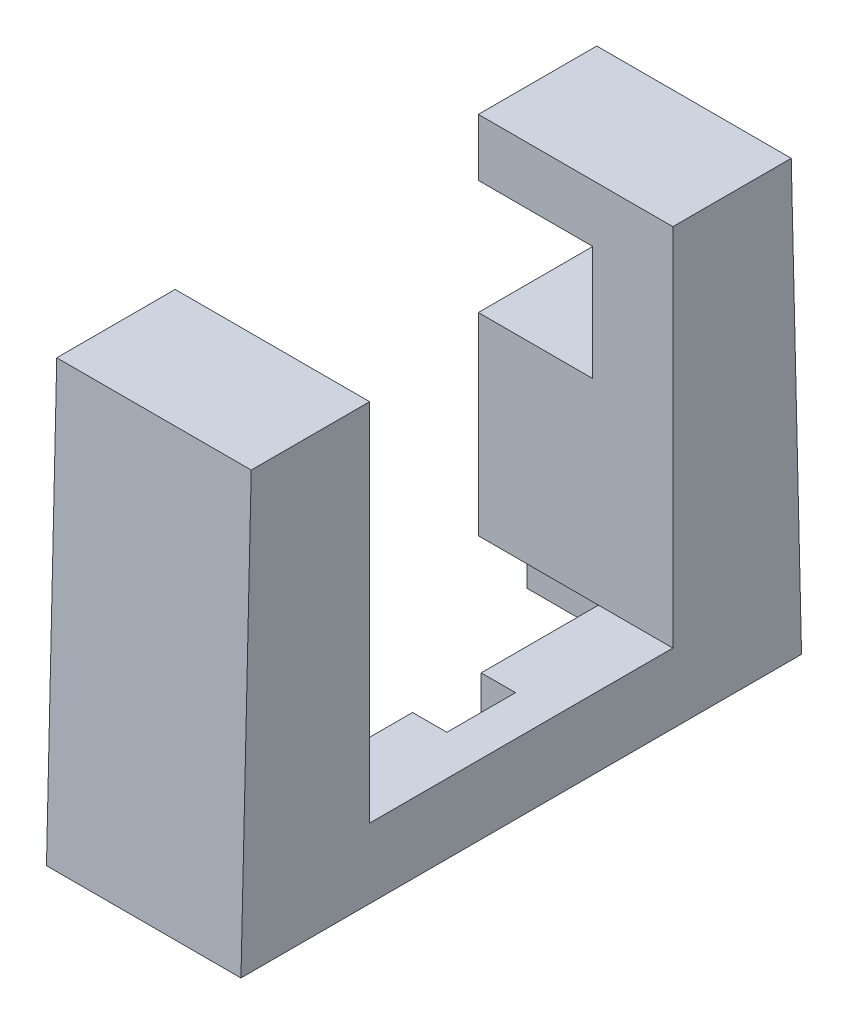
ISO-10303-21;
HEADER;
FILE_DESCRIPTION(('STEP AP214'),'2;1');
FILE_NAME('part.step','',(''),(''),'','','');
FILE_SCHEMA(('AUTOMOTIVE_DESIGN { 1 0 10303 214 1 1 1 1 }'));
ENDSEC;
DATA;
#1=APPLICATION_CONTEXT('core data for automotive mechanical design processes');
#2=APPLICATION_PROTOCOL_DEFINITION('international standard','automotive_design',2000,#1);
#3=PRODUCT_CONTEXT('',#1,'mechanical');
#4=PRODUCT('Part','Part','',(#3));
#5=PRODUCT_RELATED_PRODUCT_CATEGORY('part','',(#4));
#6=PRODUCT_DEFINITION_FORMATION('','',#4);
#7=PRODUCT_DEFINITION_CONTEXT('part definition',#1,'design');
#8=PRODUCT_DEFINITION('design','',#6,#7);
#9=PRODUCT_DEFINITION_SHAPE('','',#8);
#10=(LENGTH_UNIT() NAMED_UNIT(*) SI_UNIT(.MILLI.,.METRE.));
#11=(NAMED_UNIT(*) PLANE_ANGLE_UNIT() SI_UNIT($,.RADIAN.));
#12=(NAMED_UNIT(*) SI_UNIT($,.STERADIAN.) SOLID_ANGLE_UNIT());
#13=UNCERTAINTY_MEASURE_WITH_UNIT(LENGTH_MEASURE(1.E-05),#10,'distance_accuracy_value','');
#14=(GEOMETRIC_REPRESENTATION_CONTEXT(3) GLOBAL_UNCERTAINTY_ASSIGNED_CONTEXT((#13)) GLOBAL_UNIT_ASSIGNED_CONTEXT((#10,
#11,#12)) REPRESENTATION_CONTEXT('',''));
#15=CARTESIAN_POINT('',(0.,0.,0.));
#16=DIRECTION('',(0.,0.,1.));
#17=DIRECTION('',(1.,0.,0.));
#18=AXIS2_PLACEMENT_3D('',#15,#16,#17);
#19=CARTESIAN_POINT('',(17.,38.,-24.5));
#20=DIRECTION('',(-1.,0.,0.));
#21=DIRECTION('',(0.,0.,1.));
#22=AXIS2_PLACEMENT_3D('',#19,#20,#21);
#23=PLANE('',#22);
#24=DIRECTION('',(0.,0.999719647026643,0.0236775705874725));
#25=VECTOR('',#24,1.);
#26=CARTESIAN_POINT('',(17.,37.9786961607409,-23.600504564614));
#27=LINE('',#26,#25);
#28=CARTESIAN_POINT('',(17.,0.,-24.5));
#29=VERTEX_POINT('',#28);
#30=CARTESIAN_POINT('',(17.,38.,-23.6));
#31=VERTEX_POINT('',#30);
#32=EDGE_CURVE('E206',#29,#31,#27,.T.);
#33=ORIENTED_EDGE('',*,*,#32,.F.);
#34=DIRECTION('',(0.,0.,-1.));
#35=VECTOR('',#34,1.);
#36=CARTESIAN_POINT('',(17.,0.,0.));
#37=LINE('',#36,#35);
#38=CARTESIAN_POINT('',(17.,0.,-17.5));
#39=VERTEX_POINT('',#38);
#40=EDGE_CURVE('E41',#39,#29,#37,.T.);
#41=ORIENTED_EDGE('',*,*,#40,.F.);
#42=DIRECTION('',(0.,-1.,0.));
#43=VECTOR('',#42,1.);
#44=CARTESIAN_POINT('',(17.,71.2920240520265,-17.5));
#45=LINE('',#44,#43);
#46=CARTESIAN_POINT('',(17.,6.09999999999999,-17.5));
#47=VERTEX_POINT('',#46);
#48=EDGE_CURVE('E49',#47,#39,#45,.T.);
#49=ORIENTED_EDGE('',*,*,#48,.F.);
#50=DIRECTION('',(0.,0.,-1.));
#51=VECTOR('',#50,1.);
#52=CARTESIAN_POINT('',(17.,6.1,-24.5));
#53=LINE('',#52,#51);
#54=CARTESIAN_POINT('',(17.,6.1,-13.25));
#55=VERTEX_POINT('',#54);
#56=EDGE_CURVE('E291',#55,#47,#53,.T.);
#57=ORIENTED_EDGE('',*,*,#56,.F.);
#58=DIRECTION('',(0.,-1.,0.));
#59=VECTOR('',#58,1.);
#60=CARTESIAN_POINT('',(17.,38.,-13.25));
#61=LINE('',#60,#59);
#62=CARTESIAN_POINT('',(17.,23.,-13.25));
#63=VERTEX_POINT('',#62);
#64=EDGE_CURVE('E242',#63,#55,#61,.T.);
#65=ORIENTED_EDGE('',*,*,#64,.F.);
#66=DIRECTION('',(0.,0.,-1.));
#67=VECTOR('',#66,1.);
#68=CARTESIAN_POINT('',(17.,23.,23.25));
#69=LINE('',#68,#67);
#70=CARTESIAN_POINT('',(17.,23.,-23.25));
#71=VERTEX_POINT('',#70);
#72=EDGE_CURVE('E316',#63,#71,#69,.T.);
#73=ORIENTED_EDGE('',*,*,#72,.T.);
#74=DIRECTION('',(0.,1.,0.));
#75=VECTOR('',#74,1.);
#76=CARTESIAN_POINT('',(17.,33.,-23.25));
#77=LINE('',#76,#75);
#78=CARTESIAN_POINT('',(17.,33.,-23.25));
#79=VERTEX_POINT('',#78);
#80=EDGE_CURVE('E332',#71,#79,#77,.T.);
#81=ORIENTED_EDGE('',*,*,#80,.T.);
#82=DIRECTION('',(0.,0.,1.));
#83=VECTOR('',#82,1.);
#84=CARTESIAN_POINT('',(17.,33.,23.25));
#85=LINE('',#84,#83);
#86=CARTESIAN_POINT('',(17.,33.,-13.25));
#87=VERTEX_POINT('',#86);
#88=EDGE_CURVE('E327',#79,#87,#85,.T.);
#89=ORIENTED_EDGE('',*,*,#88,.T.);
#90=CARTESIAN_POINT('',(17.,38.,-13.25));
#91=VERTEX_POINT('',#90);
#92=EDGE_CURVE('E238',#91,#87,#61,.T.);
#93=ORIENTED_EDGE('',*,*,#92,.F.);
#94=DIRECTION('',(0.,0.,-1.));
#95=VECTOR('',#94,1.);
#96=CARTESIAN_POINT('',(17.,38.,-24.5));
#97=LINE('',#96,#95);
#98=EDGE_CURVE('E228',#91,#31,#97,.T.);
#99=ORIENTED_EDGE('',*,*,#98,.T.);
#100=EDGE_LOOP('',(#33,#41,#49,#57,#65,#73,#81,#89,#93,#99));
#101=FACE_BOUND('',#100,.T.);
#102=ADVANCED_FACE('F32',(#101),#23,.T.);
#103=CARTESIAN_POINT('',(30.5,38.001,-3.));
#104=DIRECTION('',(0.,0.,-1.));
#105=DIRECTION('',(-1.,0.,0.));
#106=AXIS2_PLACEMENT_3D('',#103,#104,#105);
#107=PLANE('',#106);
#108=DIRECTION('',(0.,-1.,0.));
#109=VECTOR('',#108,1.);
#110=CARTESIAN_POINT('',(27.5,38.001,-3.));
#111=LINE('',#110,#109);
#112=CARTESIAN_POINT('',(27.5,6.09999999999999,-3.));
#113=VERTEX_POINT('',#112);
#114=CARTESIAN_POINT('',(27.5,0.,-3.));
#115=VERTEX_POINT('',#114);
#116=EDGE_CURVE('E410',#113,#115,#111,.T.);
#117=ORIENTED_EDGE('',*,*,#116,.T.);
#118=DIRECTION('',(1.,0.,0.));
#119=VECTOR('',#118,1.);
#120=CARTESIAN_POINT('',(30.5,0.,-3.));
#121=LINE('',#120,#119);
#122=CARTESIAN_POINT('',(30.5,0.,-3.));
#123=VERTEX_POINT('',#122);
#124=EDGE_CURVE('E422',#115,#123,#121,.T.);
#125=ORIENTED_EDGE('',*,*,#124,.T.);
#126=DIRECTION('',(0.,-1.,0.));
#127=VECTOR('',#126,1.);
#128=CARTESIAN_POINT('',(30.5,38.001,-3.));
#129=LINE('',#128,#127);
#130=CARTESIAN_POINT('',(30.5,6.1,-3.));
#131=VERTEX_POINT('',#130);
#132=EDGE_CURVE('E412',#131,#123,#129,.T.);
#133=ORIENTED_EDGE('',*,*,#132,.F.);
#134=DIRECTION('',(1.,0.,0.));
#135=VECTOR('',#134,1.);
#136=CARTESIAN_POINT('',(30.5,6.1,-3.));
#137=LINE('',#136,#135);
#138=EDGE_CURVE('E405',#113,#131,#137,.T.);
#139=ORIENTED_EDGE('',*,*,#138,.F.);
#140=EDGE_LOOP('',(#117,#125,#133,#139));
#141=FACE_BOUND('',#140,.T.);
#142=ADVANCED_FACE('F482',(#141),#107,.F.);
#143=CARTESIAN_POINT('',(30.5,38.001,-3.));
#144=DIRECTION('',(1.,0.,0.));
#145=DIRECTION('',(0.,0.,-1.));
#146=AXIS2_PLACEMENT_3D('',#143,#144,#145);
#147=PLANE('',#146);
#148=ORIENTED_EDGE('',*,*,#132,.T.);
#149=DIRECTION('',(0.,0.,1.));
#150=VECTOR('',#149,1.);
#151=CARTESIAN_POINT('',(30.5,0.,-3.));
#152=LINE('',#151,#150);
#153=CARTESIAN_POINT('',(30.5,0.,3.));
#154=VERTEX_POINT('',#153);
#155=EDGE_CURVE('E419',#123,#154,#152,.T.);
#156=ORIENTED_EDGE('',*,*,#155,.T.);
#157=DIRECTION('',(0.,-1.,0.));
#158=VECTOR('',#157,1.);
#159=CARTESIAN_POINT('',(30.5,38.001,3.));
#160=LINE('',#159,#158);
#161=CARTESIAN_POINT('',(30.5,6.1,3.));
#162=VERTEX_POINT('',#161);
#163=EDGE_CURVE('E415',#162,#154,#160,.T.);
#164=ORIENTED_EDGE('',*,*,#163,.F.);
#165=DIRECTION('',(0.,0.,1.));
#166=VECTOR('',#165,1.);
#167=CARTESIAN_POINT('',(30.5,6.1,-3.));
#168=LINE('',#167,#166);
#169=EDGE_CURVE('E426',#131,#162,#168,.T.);
#170=ORIENTED_EDGE('',*,*,#169,.F.);
#171=EDGE_LOOP('',(#148,#156,#164,#170));
#172=FACE_BOUND('',#171,.T.);
#173=ADVANCED_FACE('F487',(#172),#147,.F.);
#174=CARTESIAN_POINT('',(30.5,38.001,3.));
#175=DIRECTION('',(0.,0.,1.));
#176=DIRECTION('',(1.,0.,0.));
#177=AXIS2_PLACEMENT_3D('',#174,#175,#176);
#178=PLANE('',#177);
#179=ORIENTED_EDGE('',*,*,#163,.T.);
#180=DIRECTION('',(-1.,0.,0.));
#181=VECTOR('',#180,1.);
#182=CARTESIAN_POINT('',(30.5,0.,3.));
#183=LINE('',#182,#181);
#184=CARTESIAN_POINT('',(27.5,0.,3.));
#185=VERTEX_POINT('',#184);
#186=EDGE_CURVE('E413',#154,#185,#183,.T.);
#187=ORIENTED_EDGE('',*,*,#186,.T.);
#188=DIRECTION('',(0.,-1.,0.));
#189=VECTOR('',#188,1.);
#190=CARTESIAN_POINT('',(27.5,38.001,3.));
#191=LINE('',#190,#189);
#192=CARTESIAN_POINT('',(27.5,6.09999999999999,3.));
#193=VERTEX_POINT('',#192);
#194=EDGE_CURVE('E409',#193,#185,#191,.T.);
#195=ORIENTED_EDGE('',*,*,#194,.F.);
#196=DIRECTION('',(-1.,0.,0.));
#197=VECTOR('',#196,1.);
#198=CARTESIAN_POINT('',(30.5,6.1,3.));
#199=LINE('',#198,#197);
#200=EDGE_CURVE('E381',#162,#193,#199,.T.);
#201=ORIENTED_EDGE('',*,*,#200,.F.);
#202=EDGE_LOOP('',(#179,#187,#195,#201));
#203=FACE_BOUND('',#202,.T.);
#204=ADVANCED_FACE('F503',(#203),#178,.F.);
#205=CARTESIAN_POINT('',(0.,6.1,0.));
#206=DIRECTION('',(0.,1.,0.));
#207=DIRECTION('',(0.,0.,1.));
#208=AXIS2_PLACEMENT_3D('',#205,#206,#207);
#209=PLANE('',#208);
#210=ORIENTED_EDGE('',*,*,#200,.T.);
#211=DIRECTION('',(0.,0.,1.));
#212=VECTOR('',#211,1.);
#213=CARTESIAN_POINT('',(27.5,6.09999999999999,-17.5));
#214=LINE('',#213,#212);
#215=CARTESIAN_POINT('',(27.5,6.09999999999999,13.25));
#216=VERTEX_POINT('',#215);
#217=EDGE_CURVE('E379',#193,#216,#214,.T.);
#218=ORIENTED_EDGE('',*,*,#217,.T.);
#219=DIRECTION('',(-1.,0.,0.));
#220=VECTOR('',#219,1.);
#221=CARTESIAN_POINT('',(0.,6.1,13.25));
#222=LINE('',#221,#220);
#223=CARTESIAN_POINT('',(34.,6.1,13.25));
#224=VERTEX_POINT('',#223);
#225=EDGE_CURVE('E265',#224,#216,#222,.T.);
#226=ORIENTED_EDGE('',*,*,#225,.F.);
#227=DIRECTION('',(0.,0.,-1.));
#228=VECTOR('',#227,1.);
#229=CARTESIAN_POINT('',(34.,6.1,24.5));
#230=LINE('',#229,#228);
#231=CARTESIAN_POINT('',(34.,6.1,-13.25));
#232=VERTEX_POINT('',#231);
#233=EDGE_CURVE('E211',#224,#232,#230,.T.);
#234=ORIENTED_EDGE('',*,*,#233,.T.);
#235=DIRECTION('',(1.,0.,0.));
#236=VECTOR('',#235,1.);
#237=CARTESIAN_POINT('',(0.,6.1,-13.25));
#238=LINE('',#237,#236);
#239=CARTESIAN_POINT('',(27.5,6.1,-13.25));
#240=VERTEX_POINT('',#239);
#241=EDGE_CURVE('E241',#240,#232,#238,.T.);
#242=ORIENTED_EDGE('',*,*,#241,.F.);
#243=EDGE_CURVE('E384',#240,#113,#214,.T.);
#244=ORIENTED_EDGE('',*,*,#243,.T.);
#245=ORIENTED_EDGE('',*,*,#138,.T.);
#246=ORIENTED_EDGE('',*,*,#169,.T.);
#247=EDGE_LOOP('',(#210,#218,#226,#234,#242,#244,#245,#246));
#248=FACE_BOUND('',#247,.T.);
#249=ADVANCED_FACE('F376',(#248),#209,.T.);
#250=CARTESIAN_POINT('',(-34.001,23.,23.25));
#251=DIRECTION('',(0.,-1.,0.));
#252=DIRECTION('',(0.,0.,-1.));
#253=AXIS2_PLACEMENT_3D('',#250,#251,#252);
#254=PLANE('',#253);
#255=DIRECTION('',(-1.,0.,0.));
#256=VECTOR('',#255,1.);
#257=CARTESIAN_POINT('',(-34.001,23.,-13.25));
#258=LINE('',#257,#256);
#259=CARTESIAN_POINT('',(27.,23.,-13.25));
#260=VERTEX_POINT('',#259);
#261=EDGE_CURVE('E320',#260,#63,#258,.T.);
#262=ORIENTED_EDGE('',*,*,#261,.F.);
#263=DIRECTION('',(0.,0.,-1.));
#264=VECTOR('',#263,1.);
#265=CARTESIAN_POINT('',(27.,23.,23.25));
#266=LINE('',#265,#264);
#267=CARTESIAN_POINT('',(27.,23.,-23.25));
#268=VERTEX_POINT('',#267);
#269=EDGE_CURVE('E323',#260,#268,#266,.T.);
#270=ORIENTED_EDGE('',*,*,#269,.T.);
#271=DIRECTION('',(1.,0.,0.));
#272=VECTOR('',#271,1.);
#273=CARTESIAN_POINT('',(-34.001,23.,-23.25));
#274=LINE('',#273,#272);
#275=EDGE_CURVE('E319',#71,#268,#274,.T.);
#276=ORIENTED_EDGE('',*,*,#275,.F.);
#277=ORIENTED_EDGE('',*,*,#72,.F.);
#278=EDGE_LOOP('',(#262,#270,#276,#277));
#279=FACE_BOUND('',#278,.T.);
#280=ADVANCED_FACE('F445',(#279),#254,.F.);
#281=CARTESIAN_POINT('',(34.,38.,13.25));
#282=DIRECTION('',(0.,0.,-1.));
#283=DIRECTION('',(-1.,0.,0.));
#284=AXIS2_PLACEMENT_3D('',#281,#282,#283);
#285=PLANE('',#284);
#286=DIRECTION('',(1.,0.,0.));
#287=VECTOR('',#286,1.);
#288=CARTESIAN_POINT('',(-34.001,23.,13.25));
#289=LINE('',#288,#287);
#290=CARTESIAN_POINT('',(17.,23.,13.25));
#291=VERTEX_POINT('',#290);
#292=CARTESIAN_POINT('',(27.,23.,13.25));
#293=VERTEX_POINT('',#292);
#294=EDGE_CURVE('E306',#291,#293,#289,.T.);
#295=ORIENTED_EDGE('',*,*,#294,.T.);
#296=DIRECTION('',(0.,1.,0.));
#297=VECTOR('',#296,1.);
#298=CARTESIAN_POINT('',(27.,0.,13.25));
#299=LINE('',#298,#297);
#300=CARTESIAN_POINT('',(27.,33.,13.25));
#301=VERTEX_POINT('',#300);
#302=EDGE_CURVE('E346',#293,#301,#299,.T.);
#303=ORIENTED_EDGE('',*,*,#302,.T.);
#304=DIRECTION('',(-1.,0.,0.));
#305=VECTOR('',#304,1.);
#306=CARTESIAN_POINT('',(-34.001,33.,13.25));
#307=LINE('',#306,#305);
#308=CARTESIAN_POINT('',(17.,33.,13.25));
#309=VERTEX_POINT('',#308);
#310=EDGE_CURVE('E357',#301,#309,#307,.T.);
#311=ORIENTED_EDGE('',*,*,#310,.T.);
#312=DIRECTION('',(0.,-1.,0.));
#313=VECTOR('',#312,1.);
#314=CARTESIAN_POINT('',(17.,38.,13.25));
#315=LINE('',#314,#313);
#316=CARTESIAN_POINT('',(17.,38.,13.25));
#317=VERTEX_POINT('',#316);
#318=EDGE_CURVE('E260',#317,#309,#315,.T.);
#319=ORIENTED_EDGE('',*,*,#318,.F.);
#320=DIRECTION('',(1.,0.,0.));
#321=VECTOR('',#320,1.);
#322=CARTESIAN_POINT('',(34.,38.,13.25));
#323=LINE('',#322,#321);
#324=CARTESIAN_POINT('',(34.,38.,13.25));
#325=VERTEX_POINT('',#324);
#326=EDGE_CURVE('E252',#317,#325,#323,.T.);
#327=ORIENTED_EDGE('',*,*,#326,.T.);
#328=DIRECTION('',(0.,-1.,0.));
#329=VECTOR('',#328,1.);
#330=CARTESIAN_POINT('',(34.,38.,13.25));
#331=LINE('',#330,#329);
#332=EDGE_CURVE('E256',#325,#224,#331,.T.);
#333=ORIENTED_EDGE('',*,*,#332,.T.);
#334=ORIENTED_EDGE('',*,*,#225,.T.);
#335=DIRECTION('',(1.,0.,0.));
#336=VECTOR('',#335,1.);
#337=CARTESIAN_POINT('',(34.,6.1,13.25));
#338=LINE('',#337,#336);
#339=CARTESIAN_POINT('',(17.,6.1,13.25));
#340=VERTEX_POINT('',#339);
#341=EDGE_CURVE('E307',#340,#216,#338,.T.);
#342=ORIENTED_EDGE('',*,*,#341,.F.);
#343=EDGE_CURVE('E255',#291,#340,#315,.T.);
#344=ORIENTED_EDGE('',*,*,#343,.F.);
#345=EDGE_LOOP('',(#295,#303,#311,#319,#327,#333,#334,#342,#344));
#346=FACE_BOUND('',#345,.T.);
#347=ADVANCED_FACE('F304',(#346),#285,.T.);
#348=CARTESIAN_POINT('',(34.,38.,-13.25));
#349=DIRECTION('',(0.,0.,1.));
#350=DIRECTION('',(1.,0.,0.));
#351=AXIS2_PLACEMENT_3D('',#348,#349,#350);
#352=PLANE('',#351);
#353=ORIENTED_EDGE('',*,*,#261,.T.);
#354=ORIENTED_EDGE('',*,*,#64,.T.);
#355=EDGE_CURVE('E244',#55,#240,#238,.T.);
#356=ORIENTED_EDGE('',*,*,#355,.T.);
#357=ORIENTED_EDGE('',*,*,#241,.T.);
#358=DIRECTION('',(0.,-1.,0.));
#359=VECTOR('',#358,1.);
#360=CARTESIAN_POINT('',(34.,38.,-13.25));
#361=LINE('',#360,#359);
#362=CARTESIAN_POINT('',(34.,38.,-13.25));
#363=VERTEX_POINT('',#362);
#364=EDGE_CURVE('E237',#363,#232,#361,.T.);
#365=ORIENTED_EDGE('',*,*,#364,.F.);
#366=DIRECTION('',(-1.,0.,0.));
#367=VECTOR('',#366,1.);
#368=CARTESIAN_POINT('',(34.,38.,-13.25));
#369=LINE('',#368,#367);
#370=EDGE_CURVE('E225',#363,#91,#369,.T.);
#371=ORIENTED_EDGE('',*,*,#370,.T.);
#372=ORIENTED_EDGE('',*,*,#92,.T.);
#373=DIRECTION('',(1.,0.,0.));
#374=VECTOR('',#373,1.);
#375=CARTESIAN_POINT('',(-34.001,33.,-13.25));
#376=LINE('',#375,#374);
#377=CARTESIAN_POINT('',(27.,33.,-13.25));
#378=VERTEX_POINT('',#377);
#379=EDGE_CURVE('E330',#87,#378,#376,.T.);
#380=ORIENTED_EDGE('',*,*,#379,.T.);
#381=DIRECTION('',(0.,-1.,0.));
#382=VECTOR('',#381,1.);
#383=CARTESIAN_POINT('',(27.,0.,-13.25));
#384=LINE('',#383,#382);
#385=EDGE_CURVE('E310',#378,#260,#384,.T.);
#386=ORIENTED_EDGE('',*,*,#385,.T.);
#387=EDGE_LOOP('',(#353,#354,#356,#357,#365,#371,#372,#380,#386));
#388=FACE_BOUND('',#387,.T.);
#389=ADVANCED_FACE('F439',(#388),#352,.T.);
#390=CARTESIAN_POINT('',(27.5,71.2920240520265,-17.5));
#391=DIRECTION('',(1.,0.,0.));
#392=DIRECTION('',(0.,0.,-1.));
#393=AXIS2_PLACEMENT_3D('',#390,#391,#392);
#394=PLANE('',#393);
#395=DIRECTION('',(0.,0.,1.));
#396=VECTOR('',#395,1.);
#397=CARTESIAN_POINT('',(27.5,0.,-17.5));
#398=LINE('',#397,#396);
#399=CARTESIAN_POINT('',(27.5,0.,-17.5));
#400=VERTEX_POINT('',#399);
#401=EDGE_CURVE('E399',#400,#115,#398,.T.);
#402=ORIENTED_EDGE('',*,*,#401,.T.);
#403=ORIENTED_EDGE('',*,*,#116,.F.);
#404=ORIENTED_EDGE('',*,*,#243,.F.);
#405=CARTESIAN_POINT('',(27.5,6.09999999999999,-17.5));
#406=VERTEX_POINT('',#405);
#407=EDGE_CURVE('E386',#406,#240,#214,.T.);
#408=ORIENTED_EDGE('',*,*,#407,.F.);
#409=DIRECTION('',(0.,-1.,0.));
#410=VECTOR('',#409,1.);
#411=CARTESIAN_POINT('',(27.5,71.2920240520265,-17.5));
#412=LINE('',#411,#410);
#413=EDGE_CURVE('E387',#406,#400,#412,.T.);
#414=ORIENTED_EDGE('',*,*,#413,.T.);
#415=EDGE_LOOP('',(#402,#403,#404,#408,#414));
#416=FACE_BOUND('',#415,.T.);
#417=ADVANCED_FACE('F494',(#416),#394,.F.);
#418=ORIENTED_EDGE('',*,*,#217,.F.);
#419=ORIENTED_EDGE('',*,*,#194,.T.);
#420=CARTESIAN_POINT('',(27.5,0.,17.5));
#421=VERTEX_POINT('',#420);
#422=EDGE_CURVE('E404',#185,#421,#398,.T.);
#423=ORIENTED_EDGE('',*,*,#422,.T.);
#424=DIRECTION('',(0.,-1.,0.));
#425=VECTOR('',#424,1.);
#426=CARTESIAN_POINT('',(27.5,71.2920240520265,17.5));
#427=LINE('',#426,#425);
#428=CARTESIAN_POINT('',(27.5,6.09999999999999,17.5));
#429=VERTEX_POINT('',#428);
#430=EDGE_CURVE('E292',#429,#421,#427,.T.);
#431=ORIENTED_EDGE('',*,*,#430,.F.);
#432=EDGE_CURVE('E290',#216,#429,#214,.T.);
#433=ORIENTED_EDGE('',*,*,#432,.F.);
#434=EDGE_LOOP('',(#418,#419,#423,#431,#433));
#435=FACE_BOUND('',#434,.T.);
#436=ADVANCED_FACE('F514',(#435),#394,.F.);
#437=CARTESIAN_POINT('',(0.,6.1,0.));
#438=DIRECTION('',(0.,1.,0.));
#439=DIRECTION('',(0.,0.,1.));
#440=AXIS2_PLACEMENT_3D('',#437,#438,#439);
#441=PLANE('',#440);
#442=ORIENTED_EDGE('',*,*,#341,.T.);
#443=ORIENTED_EDGE('',*,*,#432,.T.);
#444=DIRECTION('',(-1.,0.,0.));
#445=VECTOR('',#444,1.);
#446=CARTESIAN_POINT('',(27.5,6.09999999999999,17.5));
#447=LINE('',#446,#445);
#448=CARTESIAN_POINT('',(17.,6.09999999999999,17.5));
#449=VERTEX_POINT('',#448);
#450=EDGE_CURVE('E281',#429,#449,#447,.T.);
#451=ORIENTED_EDGE('',*,*,#450,.T.);
#452=DIRECTION('',(0.,0.,1.));
#453=VECTOR('',#452,1.);
#454=CARTESIAN_POINT('',(17.,6.1,0.));
#455=LINE('',#454,#453);
#456=EDGE_CURVE('E259',#340,#449,#455,.T.);
#457=ORIENTED_EDGE('',*,*,#456,.F.);
#458=EDGE_LOOP('',(#442,#443,#451,#457));
#459=FACE_BOUND('',#458,.T.);
#460=ADVANCED_FACE('F287',(#459),#441,.F.);
#461=CARTESIAN_POINT('',(0.,38.,0.));
#462=DIRECTION('',(0.,1.,0.));
#463=DIRECTION('',(0.,0.,1.));
#464=AXIS2_PLACEMENT_3D('',#461,#462,#463);
#465=PLANE('',#464);
#466=DIRECTION('',(1.,0.,0.));
#467=VECTOR('',#466,1.);
#468=CARTESIAN_POINT('',(-34.,38.,23.6));
#469=LINE('',#468,#467);
#470=CARTESIAN_POINT('',(17.,38.,23.6));
#471=VERTEX_POINT('',#470);
#472=CARTESIAN_POINT('',(34.,38.,23.6));
#473=VERTEX_POINT('',#472);
#474=EDGE_CURVE('E371',#471,#473,#469,.T.);
#475=ORIENTED_EDGE('',*,*,#474,.T.);
#476=DIRECTION('',(0.,0.,1.));
#477=VECTOR('',#476,1.);
#478=CARTESIAN_POINT('',(34.,38.,24.5));
#479=LINE('',#478,#477);
#480=EDGE_CURVE('E247',#325,#473,#479,.T.);
#481=ORIENTED_EDGE('',*,*,#480,.F.);
#482=ORIENTED_EDGE('',*,*,#326,.F.);
#483=DIRECTION('',(0.,0.,-1.));
#484=VECTOR('',#483,1.);
#485=CARTESIAN_POINT('',(17.,38.,24.5));
#486=LINE('',#485,#484);
#487=EDGE_CURVE('E250',#471,#317,#486,.T.);
#488=ORIENTED_EDGE('',*,*,#487,.F.);
#489=EDGE_LOOP('',(#475,#481,#482,#488));
#490=FACE_BOUND('',#489,.T.);
#491=ADVANCED_FACE('F369',(#490),#465,.T.);
#492=CARTESIAN_POINT('',(34.,6.1,24.5));
#493=DIRECTION('',(-1.,0.,0.));
#494=DIRECTION('',(0.,0.,1.));
#495=AXIS2_PLACEMENT_3D('',#492,#493,#494);
#496=PLANE('',#495);
#497=DIRECTION('',(0.,0.,-1.));
#498=VECTOR('',#497,1.);
#499=CARTESIAN_POINT('',(34.,0.,24.5));
#500=LINE('',#499,#498);
#501=CARTESIAN_POINT('',(34.,0.,24.5));
#502=VERTEX_POINT('',#501);
#503=CARTESIAN_POINT('',(34.,1.70870262383715E-13,-24.5));
#504=VERTEX_POINT('',#503);
#505=EDGE_CURVE('E219',#502,#504,#500,.T.);
#506=ORIENTED_EDGE('',*,*,#505,.T.);
#507=DIRECTION('',(0.,-0.999719647026643,-0.0236775705874725));
#508=VECTOR('',#507,1.);
#509=CARTESIAN_POINT('',(34.,1.70870262383715E-13,-24.5));
#510=LINE('',#509,#508);
#511=CARTESIAN_POINT('',(34.,38.,-23.6));
#512=VERTEX_POINT('',#511);
#513=EDGE_CURVE('E204',#512,#504,#510,.T.);
#514=ORIENTED_EDGE('',*,*,#513,.F.);
#515=DIRECTION('',(0.,0.,1.));
#516=VECTOR('',#515,1.);
#517=CARTESIAN_POINT('',(34.,38.,-24.5));
#518=LINE('',#517,#516);
#519=EDGE_CURVE('E215',#512,#363,#518,.T.);
#520=ORIENTED_EDGE('',*,*,#519,.T.);
#521=ORIENTED_EDGE('',*,*,#364,.T.);
#522=ORIENTED_EDGE('',*,*,#233,.F.);
#523=ORIENTED_EDGE('',*,*,#332,.F.);
#524=ORIENTED_EDGE('',*,*,#480,.T.);
#525=DIRECTION('',(0.,0.999719647026643,-0.0236775705874732));
#526=VECTOR('',#525,1.);
#527=CARTESIAN_POINT('',(34.,0.,24.5));
#528=LINE('',#527,#526);
#529=EDGE_CURVE('E430',#502,#473,#528,.T.);
#530=ORIENTED_EDGE('',*,*,#529,.F.);
#531=EDGE_LOOP('',(#506,#514,#520,#521,#522,#523,#524,#530));
#532=FACE_BOUND('',#531,.T.);
#533=ADVANCED_FACE('F34',(#532),#496,.F.);
#534=CARTESIAN_POINT('',(0.,38.,0.));
#535=DIRECTION('',(0.,-1.,0.));
#536=DIRECTION('',(0.,0.,-1.));
#537=AXIS2_PLACEMENT_3D('',#534,#535,#536);
#538=PLANE('',#537);
#539=ORIENTED_EDGE('',*,*,#519,.F.);
#540=DIRECTION('',(-1.,0.,0.));
#541=VECTOR('',#540,1.);
#542=CARTESIAN_POINT('',(0.,38.,-23.6));
#543=LINE('',#542,#541);
#544=EDGE_CURVE('E200',#512,#31,#543,.T.);
#545=ORIENTED_EDGE('',*,*,#544,.T.);
#546=ORIENTED_EDGE('',*,*,#98,.F.);
#547=ORIENTED_EDGE('',*,*,#370,.F.);
#548=EDGE_LOOP('',(#539,#545,#546,#547));
#549=FACE_BOUND('',#548,.T.);
#550=ADVANCED_FACE('F223',(#549),#538,.F.);
#551=CARTESIAN_POINT('',(0.,0.,0.));
#552=DIRECTION('',(0.,1.,0.));
#553=DIRECTION('',(0.,0.,1.));
#554=AXIS2_PLACEMENT_3D('',#551,#552,#553);
#555=PLANE('',#554);
#556=DIRECTION('',(1.,0.,0.));
#557=VECTOR('',#556,1.);
#558=CARTESIAN_POINT('',(34.,0.,24.5));
#559=LINE('',#558,#557);
#560=CARTESIAN_POINT('',(17.,0.,24.5));
#561=VERTEX_POINT('',#560);
#562=EDGE_CURVE('E268',#561,#502,#559,.T.);
#563=ORIENTED_EDGE('',*,*,#562,.F.);
#564=CARTESIAN_POINT('',(17.,0.,17.5));
#565=VERTEX_POINT('',#564);
#566=EDGE_CURVE('E11',#561,#565,#37,.T.);
#567=ORIENTED_EDGE('',*,*,#566,.T.);
#568=DIRECTION('',(-1.,0.,0.));
#569=VECTOR('',#568,1.);
#570=CARTESIAN_POINT('',(27.5,0.,17.5));
#571=LINE('',#570,#569);
#572=EDGE_CURVE('E283',#421,#565,#571,.T.);
#573=ORIENTED_EDGE('',*,*,#572,.F.);
#574=ORIENTED_EDGE('',*,*,#422,.F.);
#575=ORIENTED_EDGE('',*,*,#186,.F.);
#576=ORIENTED_EDGE('',*,*,#155,.F.);
#577=ORIENTED_EDGE('',*,*,#124,.F.);
#578=ORIENTED_EDGE('',*,*,#401,.F.);
#579=DIRECTION('',(1.,0.,0.));
#580=VECTOR('',#579,1.);
#581=CARTESIAN_POINT('',(27.5,0.,-17.5));
#582=LINE('',#581,#580);
#583=EDGE_CURVE('E402',#39,#400,#582,.T.);
#584=ORIENTED_EDGE('',*,*,#583,.F.);
#585=ORIENTED_EDGE('',*,*,#40,.T.);
#586=DIRECTION('',(-1.,0.,0.));
#587=VECTOR('',#586,1.);
#588=CARTESIAN_POINT('',(34.,0.,-24.5));
#589=LINE('',#588,#587);
#590=EDGE_CURVE('E271',#504,#29,#589,.T.);
#591=ORIENTED_EDGE('',*,*,#590,.F.);
#592=ORIENTED_EDGE('',*,*,#505,.F.);
#593=EDGE_LOOP('',(#563,#567,#573,#574,#575,#576,#577,#578,#584,#585,#591,#592));
#594=FACE_BOUND('',#593,.T.);
#595=ADVANCED_FACE('F434',(#594),#555,.F.);
#596=CARTESIAN_POINT('',(-34.,1.70870262383715E-13,-24.5));
#597=DIRECTION('',(0.,-0.0236775705874725,0.999719647026643));
#598=DIRECTION('',(0.,-0.999719647026643,-0.0236775705874725));
#599=AXIS2_PLACEMENT_3D('',#596,#597,#598);
#600=PLANE('',#599);
#601=ORIENTED_EDGE('',*,*,#590,.T.);
#602=ORIENTED_EDGE('',*,*,#32,.T.);
#603=ORIENTED_EDGE('',*,*,#544,.F.);
#604=ORIENTED_EDGE('',*,*,#513,.T.);
#605=EDGE_LOOP('',(#601,#602,#603,#604));
#606=FACE_BOUND('',#605,.T.);
#607=ADVANCED_FACE('F203',(#606),#600,.F.);
#608=CARTESIAN_POINT('',(-34.,0.,24.5));
#609=DIRECTION('',(0.,-0.0236775705874732,-0.999719647026643));
#610=DIRECTION('',(0.,0.999719647026643,-0.0236775705874732));
#611=AXIS2_PLACEMENT_3D('',#608,#609,#610);
#612=PLANE('',#611);
#613=DIRECTION('',(0.,-0.999719647026643,0.0236775705874732));
#614=VECTOR('',#613,1.);
#615=CARTESIAN_POINT('',(17.,37.9786961607409,23.600504564614));
#616=LINE('',#615,#614);
#617=EDGE_CURVE('E366',#471,#561,#616,.T.);
#618=ORIENTED_EDGE('',*,*,#617,.T.);
#619=ORIENTED_EDGE('',*,*,#562,.T.);
#620=ORIENTED_EDGE('',*,*,#529,.T.);
#621=ORIENTED_EDGE('',*,*,#474,.F.);
#622=EDGE_LOOP('',(#618,#619,#620,#621));
#623=FACE_BOUND('',#622,.T.);
#624=ADVANCED_FACE('F433',(#623),#612,.F.);
#625=CARTESIAN_POINT('',(27.5,71.2920240520265,17.5));
#626=DIRECTION('',(0.,0.,1.));
#627=DIRECTION('',(1.,0.,0.));
#628=AXIS2_PLACEMENT_3D('',#625,#626,#627);
#629=PLANE('',#628);
#630=ORIENTED_EDGE('',*,*,#572,.T.);
#631=DIRECTION('',(0.,1.,0.));
#632=VECTOR('',#631,1.);
#633=CARTESIAN_POINT('',(17.,71.2920240520265,17.5));
#634=LINE('',#633,#632);
#635=EDGE_CURVE('E36',#565,#449,#634,.T.);
#636=ORIENTED_EDGE('',*,*,#635,.T.);
#637=ORIENTED_EDGE('',*,*,#450,.F.);
#638=ORIENTED_EDGE('',*,*,#430,.T.);
#639=EDGE_LOOP('',(#630,#636,#637,#638));
#640=FACE_BOUND('',#639,.T.);
#641=ADVANCED_FACE('F279',(#640),#629,.F.);
#642=ORIENTED_EDGE('',*,*,#56,.T.);
#643=DIRECTION('',(1.,0.,0.));
#644=VECTOR('',#643,1.);
#645=CARTESIAN_POINT('',(27.5,6.09999999999999,-17.5));
#646=LINE('',#645,#644);
#647=EDGE_CURVE('E393',#47,#406,#646,.T.);
#648=ORIENTED_EDGE('',*,*,#647,.T.);
#649=ORIENTED_EDGE('',*,*,#407,.T.);
#650=ORIENTED_EDGE('',*,*,#355,.F.);
#651=EDGE_LOOP('',(#642,#648,#649,#650));
#652=FACE_BOUND('',#651,.T.);
#653=ADVANCED_FACE('F442',(#652),#441,.F.);
#654=CARTESIAN_POINT('',(27.5,71.2920240520265,-17.5));
#655=DIRECTION('',(0.,0.,-1.));
#656=DIRECTION('',(-1.,0.,0.));
#657=AXIS2_PLACEMENT_3D('',#654,#655,#656);
#658=PLANE('',#657);
#659=ORIENTED_EDGE('',*,*,#647,.F.);
#660=ORIENTED_EDGE('',*,*,#48,.T.);
#661=ORIENTED_EDGE('',*,*,#583,.T.);
#662=ORIENTED_EDGE('',*,*,#413,.F.);
#663=EDGE_LOOP('',(#659,#660,#661,#662));
#664=FACE_BOUND('',#663,.T.);
#665=ADVANCED_FACE('F506',(#664),#658,.F.);
#666=CARTESIAN_POINT('',(27.,0.,0.));
#667=DIRECTION('',(1.,0.,0.));
#668=DIRECTION('',(0.,0.,-1.));
#669=AXIS2_PLACEMENT_3D('',#666,#667,#668);
#670=PLANE('',#669);
#671=DIRECTION('',(0.,0.,1.));
#672=VECTOR('',#671,1.);
#673=CARTESIAN_POINT('',(27.,33.,23.25));
#674=LINE('',#673,#672);
#675=CARTESIAN_POINT('',(27.,33.,-23.25));
#676=VERTEX_POINT('',#675);
#677=EDGE_CURVE('E308',#676,#378,#674,.T.);
#678=ORIENTED_EDGE('',*,*,#677,.F.);
#679=DIRECTION('',(0.,1.,0.));
#680=VECTOR('',#679,1.);
#681=CARTESIAN_POINT('',(27.,33.,-23.25));
#682=LINE('',#681,#680);
#683=EDGE_CURVE('E324',#268,#676,#682,.T.);
#684=ORIENTED_EDGE('',*,*,#683,.F.);
#685=ORIENTED_EDGE('',*,*,#269,.F.);
#686=ORIENTED_EDGE('',*,*,#385,.F.);
#687=EDGE_LOOP('',(#678,#684,#685,#686));
#688=FACE_BOUND('',#687,.T.);
#689=ADVANCED_FACE('F450',(#688),#670,.F.);
#690=CARTESIAN_POINT('',(-34.001,33.,-23.25));
#691=DIRECTION('',(0.,0.,-1.));
#692=DIRECTION('',(-1.,0.,0.));
#693=AXIS2_PLACEMENT_3D('',#690,#691,#692);
#694=PLANE('',#693);
#695=ORIENTED_EDGE('',*,*,#275,.T.);
#696=ORIENTED_EDGE('',*,*,#683,.T.);
#697=DIRECTION('',(1.,0.,0.));
#698=VECTOR('',#697,1.);
#699=CARTESIAN_POINT('',(-34.001,33.,-23.25));
#700=LINE('',#699,#698);
#701=EDGE_CURVE('E331',#79,#676,#700,.T.);
#702=ORIENTED_EDGE('',*,*,#701,.F.);
#703=ORIENTED_EDGE('',*,*,#80,.F.);
#704=EDGE_LOOP('',(#695,#696,#702,#703));
#705=FACE_BOUND('',#704,.T.);
#706=ADVANCED_FACE('F454',(#705),#694,.F.);
#707=CARTESIAN_POINT('',(-34.001,33.,23.25));
#708=DIRECTION('',(0.,1.,0.));
#709=DIRECTION('',(0.,0.,1.));
#710=AXIS2_PLACEMENT_3D('',#707,#708,#709);
#711=PLANE('',#710);
#712=ORIENTED_EDGE('',*,*,#701,.T.);
#713=ORIENTED_EDGE('',*,*,#677,.T.);
#714=ORIENTED_EDGE('',*,*,#379,.F.);
#715=ORIENTED_EDGE('',*,*,#88,.F.);
#716=EDGE_LOOP('',(#712,#713,#714,#715));
#717=FACE_BOUND('',#716,.T.);
#718=ADVANCED_FACE('F456',(#717),#711,.F.);
#719=CARTESIAN_POINT('',(-34.001,23.,23.25));
#720=DIRECTION('',(0.,-1.,0.));
#721=DIRECTION('',(0.,0.,-1.));
#722=AXIS2_PLACEMENT_3D('',#719,#720,#721);
#723=PLANE('',#722);
#724=DIRECTION('',(0.,0.,-1.));
#725=VECTOR('',#724,1.);
#726=CARTESIAN_POINT('',(17.,23.,23.25));
#727=LINE('',#726,#725);
#728=CARTESIAN_POINT('',(17.,23.,23.25));
#729=VERTEX_POINT('',#728);
#730=EDGE_CURVE('E301',#729,#291,#727,.T.);
#731=ORIENTED_EDGE('',*,*,#730,.F.);
#732=DIRECTION('',(1.,0.,0.));
#733=VECTOR('',#732,1.);
#734=CARTESIAN_POINT('',(-34.001,23.,23.25));
#735=LINE('',#734,#733);
#736=CARTESIAN_POINT('',(27.,23.,23.25));
#737=VERTEX_POINT('',#736);
#738=EDGE_CURVE('E226',#729,#737,#735,.T.);
#739=ORIENTED_EDGE('',*,*,#738,.T.);
#740=DIRECTION('',(0.,0.,-1.));
#741=VECTOR('',#740,1.);
#742=CARTESIAN_POINT('',(27.,23.,23.25));
#743=LINE('',#742,#741);
#744=EDGE_CURVE('E337',#737,#293,#743,.T.);
#745=ORIENTED_EDGE('',*,*,#744,.T.);
#746=ORIENTED_EDGE('',*,*,#294,.F.);
#747=EDGE_LOOP('',(#731,#739,#745,#746));
#748=FACE_BOUND('',#747,.T.);
#749=ADVANCED_FACE('F458',(#748),#723,.F.);
#750=CARTESIAN_POINT('',(27.,0.,0.));
#751=DIRECTION('',(1.,0.,0.));
#752=DIRECTION('',(0.,0.,-1.));
#753=AXIS2_PLACEMENT_3D('',#750,#751,#752);
#754=PLANE('',#753);
#755=ORIENTED_EDGE('',*,*,#744,.F.);
#756=DIRECTION('',(0.,-1.,0.));
#757=VECTOR('',#756,1.);
#758=CARTESIAN_POINT('',(27.,33.,23.25));
#759=LINE('',#758,#757);
#760=CARTESIAN_POINT('',(27.,33.,23.25));
#761=VERTEX_POINT('',#760);
#762=EDGE_CURVE('E345',#761,#737,#759,.T.);
#763=ORIENTED_EDGE('',*,*,#762,.F.);
#764=DIRECTION('',(0.,0.,1.));
#765=VECTOR('',#764,1.);
#766=CARTESIAN_POINT('',(27.,33.,23.25));
#767=LINE('',#766,#765);
#768=EDGE_CURVE('E233',#301,#761,#767,.T.);
#769=ORIENTED_EDGE('',*,*,#768,.F.);
#770=ORIENTED_EDGE('',*,*,#302,.F.);
#771=EDGE_LOOP('',(#755,#763,#769,#770));
#772=FACE_BOUND('',#771,.T.);
#773=ADVANCED_FACE('F464',(#772),#754,.F.);
#774=CARTESIAN_POINT('',(-34.001,33.,23.25));
#775=DIRECTION('',(0.,1.,0.));
#776=DIRECTION('',(0.,0.,1.));
#777=AXIS2_PLACEMENT_3D('',#774,#775,#776);
#778=PLANE('',#777);
#779=ORIENTED_EDGE('',*,*,#768,.T.);
#780=DIRECTION('',(1.,0.,0.));
#781=VECTOR('',#780,1.);
#782=CARTESIAN_POINT('',(-34.001,33.,23.25));
#783=LINE('',#782,#781);
#784=CARTESIAN_POINT('',(17.,33.,23.25));
#785=VERTEX_POINT('',#784);
#786=EDGE_CURVE('E348',#785,#761,#783,.T.);
#787=ORIENTED_EDGE('',*,*,#786,.F.);
#788=DIRECTION('',(0.,0.,1.));
#789=VECTOR('',#788,1.);
#790=CARTESIAN_POINT('',(17.,33.,23.25));
#791=LINE('',#790,#789);
#792=EDGE_CURVE('E350',#309,#785,#791,.T.);
#793=ORIENTED_EDGE('',*,*,#792,.F.);
#794=ORIENTED_EDGE('',*,*,#310,.F.);
#795=EDGE_LOOP('',(#779,#787,#793,#794));
#796=FACE_BOUND('',#795,.T.);
#797=ADVANCED_FACE('F476',(#796),#778,.F.);
#798=CARTESIAN_POINT('',(-34.001,33.,23.25));
#799=DIRECTION('',(0.,0.,1.));
#800=DIRECTION('',(1.,0.,0.));
#801=AXIS2_PLACEMENT_3D('',#798,#799,#800);
#802=PLANE('',#801);
#803=ORIENTED_EDGE('',*,*,#786,.T.);
#804=ORIENTED_EDGE('',*,*,#762,.T.);
#805=ORIENTED_EDGE('',*,*,#738,.F.);
#806=DIRECTION('',(0.,-1.,0.));
#807=VECTOR('',#806,1.);
#808=CARTESIAN_POINT('',(17.,33.,23.25));
#809=LINE('',#808,#807);
#810=EDGE_CURVE('E230',#785,#729,#809,.T.);
#811=ORIENTED_EDGE('',*,*,#810,.F.);
#812=EDGE_LOOP('',(#803,#804,#805,#811));
#813=FACE_BOUND('',#812,.T.);
#814=ADVANCED_FACE('F471',(#813),#802,.F.);
#815=CARTESIAN_POINT('',(17.,38.,24.5));
#816=DIRECTION('',(-1.,0.,0.));
#817=DIRECTION('',(0.,0.,1.));
#818=AXIS2_PLACEMENT_3D('',#815,#816,#817);
#819=PLANE('',#818);
#820=ORIENTED_EDGE('',*,*,#617,.F.);
#821=ORIENTED_EDGE('',*,*,#487,.T.);
#822=ORIENTED_EDGE('',*,*,#318,.T.);
#823=ORIENTED_EDGE('',*,*,#792,.T.);
#824=ORIENTED_EDGE('',*,*,#810,.T.);
#825=ORIENTED_EDGE('',*,*,#730,.T.);
#826=ORIENTED_EDGE('',*,*,#343,.T.);
#827=ORIENTED_EDGE('',*,*,#456,.T.);
#828=ORIENTED_EDGE('',*,*,#635,.F.);
#829=ORIENTED_EDGE('',*,*,#566,.F.);
#830=EDGE_LOOP('',(#820,#821,#822,#823,#824,#825,#826,#827,#828,#829));
#831=FACE_BOUND('',#830,.T.);
#832=ADVANCED_FACE('F296',(#831),#819,.T.);
#833=CLOSED_SHELL('',(#102,#142,#173,#204,#249,#280,#347,#389,#417,#436,#460,#491,#533,#550,
#595,#607,#624,#641,#653,#665,#689,#706,#718,#749,#773,#797,#814,#832));
#834=MANIFOLD_SOLID_BREP('B2',#833);
#835=ADVANCED_BREP_SHAPE_REPRESENTATION('',(#18,#834),#14);
#836=SHAPE_DEFINITION_REPRESENTATION(#9,#835);
ENDSEC;
END-ISO-10303-21;
